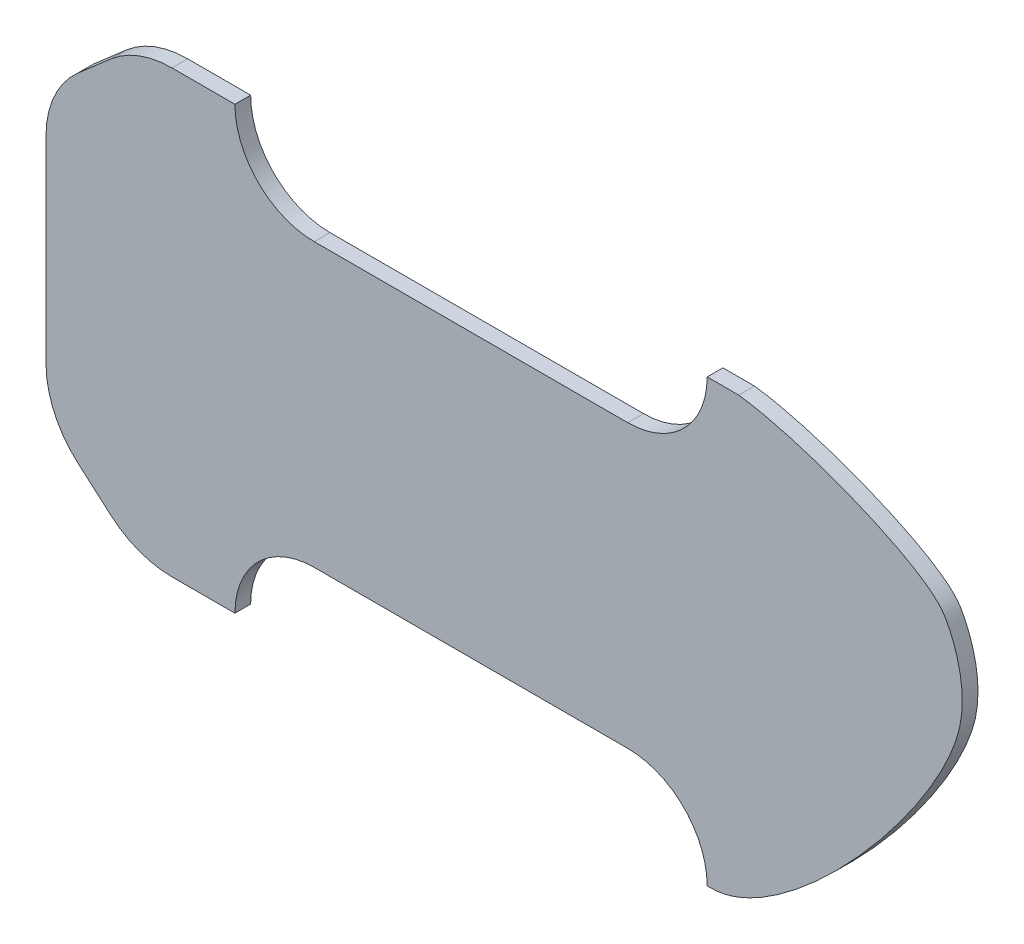
ISO-10303-21;
HEADER;
FILE_DESCRIPTION(('STEP AP214'),'2;1');
FILE_NAME('part.step','',(''),(''),'','','');
FILE_SCHEMA(('AUTOMOTIVE_DESIGN { 1 0 10303 214 1 1 1 1 }'));
ENDSEC;
DATA;
#1=APPLICATION_CONTEXT('core data for automotive mechanical design processes');
#2=APPLICATION_PROTOCOL_DEFINITION('international standard','automotive_design',2000,#1);
#3=PRODUCT_CONTEXT('',#1,'mechanical');
#4=PRODUCT('Part','Part','',(#3));
#5=PRODUCT_RELATED_PRODUCT_CATEGORY('part','',(#4));
#6=PRODUCT_DEFINITION_FORMATION('','',#4);
#7=PRODUCT_DEFINITION_CONTEXT('part definition',#1,'design');
#8=PRODUCT_DEFINITION('design','',#6,#7);
#9=PRODUCT_DEFINITION_SHAPE('','',#8);
#10=(LENGTH_UNIT() NAMED_UNIT(*) SI_UNIT(.MILLI.,.METRE.));
#11=(NAMED_UNIT(*) PLANE_ANGLE_UNIT() SI_UNIT($,.RADIAN.));
#12=(NAMED_UNIT(*) SI_UNIT($,.STERADIAN.) SOLID_ANGLE_UNIT());
#13=UNCERTAINTY_MEASURE_WITH_UNIT(LENGTH_MEASURE(1.E-05),#10,'distance_accuracy_value','');
#14=(GEOMETRIC_REPRESENTATION_CONTEXT(3) GLOBAL_UNCERTAINTY_ASSIGNED_CONTEXT((#13)) GLOBAL_UNIT_ASSIGNED_CONTEXT((#10,
#11,#12)) REPRESENTATION_CONTEXT('',''));
#15=CARTESIAN_POINT('',(0.,0.,0.));
#16=DIRECTION('',(0.,0.,1.));
#17=DIRECTION('',(1.,0.,0.));
#18=AXIS2_PLACEMENT_3D('',#15,#16,#17);
#19=CARTESIAN_POINT('',(-97.4720081677922,29.9649376847253,5.));
#20=DIRECTION('',(0.,0.,-1.));
#21=DIRECTION('',(-1.,0.,0.));
#22=AXIS2_PLACEMENT_3D('',#19,#20,#21);
#23=CYLINDRICAL_SURFACE('',#22,29.6194004211379);
#24=CARTESIAN_POINT('',(-97.4720081677922,29.9649376847253,0.));
#25=DIRECTION('',(0.,0.,1.));
#26=DIRECTION('',(-1.,0.,0.));
#27=AXIS2_PLACEMENT_3D('',#24,#25,#26);
#28=CIRCLE('',#27,29.6194004211379);
#29=CARTESIAN_POINT('',(-97.4720081677922,59.5843381058632,0.));
#30=VERTEX_POINT('',#29);
#31=CARTESIAN_POINT('',(-116.938550580624,52.2889742327407,0.));
#32=VERTEX_POINT('',#31);
#33=EDGE_CURVE('E186',#30,#32,#28,.T.);
#34=ORIENTED_EDGE('',*,*,#33,.T.);
#35=DIRECTION('',(0.,0.,-1.));
#36=VECTOR('',#35,1.);
#37=CARTESIAN_POINT('',(-116.938550580624,52.2889742327407,5.));
#38=LINE('',#37,#36);
#39=CARTESIAN_POINT('',(-116.938550580624,52.2889742327407,5.));
#40=VERTEX_POINT('',#39);
#41=EDGE_CURVE('E11',#40,#32,#38,.T.);
#42=ORIENTED_EDGE('',*,*,#41,.F.);
#43=CARTESIAN_POINT('',(-97.4720081677922,29.9649376847253,5.));
#44=DIRECTION('',(0.,0.,1.));
#45=DIRECTION('',(-1.,0.,0.));
#46=AXIS2_PLACEMENT_3D('',#43,#44,#45);
#47=CIRCLE('',#46,29.6194004211379);
#48=CARTESIAN_POINT('',(-97.4720081677922,59.5843381058632,5.));
#49=VERTEX_POINT('',#48);
#50=EDGE_CURVE('E225',#49,#40,#47,.T.);
#51=ORIENTED_EDGE('',*,*,#50,.F.);
#52=DIRECTION('',(0.,0.,-1.));
#53=VECTOR('',#52,1.);
#54=CARTESIAN_POINT('',(-97.4720081677922,59.5843381058632,5.));
#55=LINE('',#54,#53);
#56=EDGE_CURVE('E182',#49,#30,#55,.T.);
#57=ORIENTED_EDGE('',*,*,#56,.T.);
#58=EDGE_LOOP('',(#34,#42,#51,#57));
#59=FACE_BOUND('',#58,.T.);
#60=ADVANCED_FACE('F30',(#59),#23,.T.);
#61=CARTESIAN_POINT('',(-116.938550580624,52.2889742327407,5.));
#62=DIRECTION('',(0.657222703229989,-0.753696436477622,0.));
#63=DIRECTION('',(0.753696436477622,0.657222703229989,0.));
#64=AXIS2_PLACEMENT_3D('',#61,#62,#63);
#65=PLANE('',#64);
#66=DIRECTION('',(-0.753696436477622,-0.657222703229989,0.));
#67=VECTOR('',#66,1.);
#68=CARTESIAN_POINT('',(-116.938550580624,52.2889742327407,0.));
#69=LINE('',#68,#67);
#70=CARTESIAN_POINT('',(-127.318550580623,43.2376223497344,0.));
#71=VERTEX_POINT('',#70);
#72=EDGE_CURVE('E189',#32,#71,#69,.T.);
#73=ORIENTED_EDGE('',*,*,#72,.T.);
#74=DIRECTION('',(0.,0.,-1.));
#75=VECTOR('',#74,1.);
#76=CARTESIAN_POINT('',(-127.318550580623,43.2376223497344,5.));
#77=LINE('',#76,#75);
#78=CARTESIAN_POINT('',(-127.318550580623,43.2376223497344,5.));
#79=VERTEX_POINT('',#78);
#80=EDGE_CURVE('E38',#79,#71,#77,.T.);
#81=ORIENTED_EDGE('',*,*,#80,.F.);
#82=DIRECTION('',(-0.753696436477622,-0.657222703229989,0.));
#83=VECTOR('',#82,1.);
#84=CARTESIAN_POINT('',(-116.938550580624,52.2889742327407,5.));
#85=LINE('',#84,#83);
#86=EDGE_CURVE('E119',#40,#79,#85,.T.);
#87=ORIENTED_EDGE('',*,*,#86,.F.);
#88=ORIENTED_EDGE('',*,*,#41,.T.);
#89=EDGE_LOOP('',(#73,#81,#87,#88));
#90=FACE_BOUND('',#89,.T.);
#91=ADVANCED_FACE('F356',(#90),#65,.F.);
#92=CARTESIAN_POINT('',(-107.852008167791,20.913585801719,5.));
#93=DIRECTION('',(0.,0.,-1.));
#94=DIRECTION('',(-1.,0.,0.));
#95=AXIS2_PLACEMENT_3D('',#92,#93,#94);
#96=CYLINDRICAL_SURFACE('',#95,29.6194004211379);
#97=CARTESIAN_POINT('',(-107.852008167791,20.913585801719,0.));
#98=DIRECTION('',(0.,0.,1.));
#99=DIRECTION('',(-1.,0.,0.));
#100=AXIS2_PLACEMENT_3D('',#97,#98,#99);
#101=CIRCLE('',#100,29.6194004211379);
#102=CARTESIAN_POINT('',(-137.471408588929,20.913585801719,0.));
#103=VERTEX_POINT('',#102);
#104=EDGE_CURVE('E191',#71,#103,#101,.T.);
#105=ORIENTED_EDGE('',*,*,#104,.T.);
#106=DIRECTION('',(0.,0.,-1.));
#107=VECTOR('',#106,1.);
#108=CARTESIAN_POINT('',(-137.471408588929,20.913585801719,5.));
#109=LINE('',#108,#107);
#110=CARTESIAN_POINT('',(-137.471408588929,20.913585801719,5.));
#111=VERTEX_POINT('',#110);
#112=EDGE_CURVE('E262',#111,#103,#109,.T.);
#113=ORIENTED_EDGE('',*,*,#112,.F.);
#114=CARTESIAN_POINT('',(-107.852008167791,20.913585801719,5.));
#115=DIRECTION('',(0.,0.,1.));
#116=DIRECTION('',(-1.,0.,0.));
#117=AXIS2_PLACEMENT_3D('',#114,#115,#116);
#118=CIRCLE('',#117,29.6194004211379);
#119=EDGE_CURVE('E270',#79,#111,#118,.T.);
#120=ORIENTED_EDGE('',*,*,#119,.F.);
#121=ORIENTED_EDGE('',*,*,#80,.T.);
#122=EDGE_LOOP('',(#105,#113,#120,#121));
#123=FACE_BOUND('',#122,.T.);
#124=ADVANCED_FACE('F268',(#123),#96,.T.);
#125=CARTESIAN_POINT('',(-137.471408588929,-41.7462614729989,5.));
#126=DIRECTION('',(1.,0.,0.));
#127=DIRECTION('',(0.,1.,0.));
#128=AXIS2_PLACEMENT_3D('',#125,#126,#127);
#129=PLANE('',#128);
#130=DIRECTION('',(0.,-1.,0.));
#131=VECTOR('',#130,1.);
#132=CARTESIAN_POINT('',(-137.471408588929,-41.7462614729989,0.));
#133=LINE('',#132,#131);
#134=CARTESIAN_POINT('',(-137.471408588929,-41.7462614729989,0.));
#135=VERTEX_POINT('',#134);
#136=EDGE_CURVE('E193',#103,#135,#133,.T.);
#137=ORIENTED_EDGE('',*,*,#136,.T.);
#138=DIRECTION('',(0.,0.,-1.));
#139=VECTOR('',#138,1.);
#140=CARTESIAN_POINT('',(-137.471408588929,-41.7462614729989,5.));
#141=LINE('',#140,#139);
#142=CARTESIAN_POINT('',(-137.471408588929,-41.7462614729989,5.));
#143=VERTEX_POINT('',#142);
#144=EDGE_CURVE('E259',#143,#135,#141,.T.);
#145=ORIENTED_EDGE('',*,*,#144,.F.);
#146=DIRECTION('',(0.,-1.,0.));
#147=VECTOR('',#146,1.);
#148=CARTESIAN_POINT('',(-137.471408588929,-41.7462614729989,5.));
#149=LINE('',#148,#147);
#150=EDGE_CURVE('E288',#111,#143,#149,.T.);
#151=ORIENTED_EDGE('',*,*,#150,.F.);
#152=ORIENTED_EDGE('',*,*,#112,.T.);
#153=EDGE_LOOP('',(#137,#145,#151,#152));
#154=FACE_BOUND('',#153,.T.);
#155=ADVANCED_FACE('F279',(#154),#129,.F.);
#156=CARTESIAN_POINT('',(-107.852008167791,-41.7462614729989,5.));
#157=DIRECTION('',(0.,0.,-1.));
#158=DIRECTION('',(-1.,0.,0.));
#159=AXIS2_PLACEMENT_3D('',#156,#157,#158);
#160=CYLINDRICAL_SURFACE('',#159,29.6194004211379);
#161=CARTESIAN_POINT('',(-107.852008167791,-41.7462614729989,0.));
#162=DIRECTION('',(0.,0.,1.));
#163=DIRECTION('',(-1.,0.,0.));
#164=AXIS2_PLACEMENT_3D('',#161,#162,#163);
#165=CIRCLE('',#164,29.6194004211379);
#166=CARTESIAN_POINT('',(-127.316898811166,-64.0717382551234,0.));
#167=VERTEX_POINT('',#166);
#168=EDGE_CURVE('E195',#135,#167,#165,.T.);
#169=ORIENTED_EDGE('',*,*,#168,.T.);
#170=DIRECTION('',(0.,0.,-1.));
#171=VECTOR('',#170,1.);
#172=CARTESIAN_POINT('',(-127.316898811166,-64.0717382551234,5.));
#173=LINE('',#172,#171);
#174=CARTESIAN_POINT('',(-127.316898811166,-64.0717382551234,5.));
#175=VERTEX_POINT('',#174);
#176=EDGE_CURVE('E256',#175,#167,#173,.T.);
#177=ORIENTED_EDGE('',*,*,#176,.F.);
#178=CARTESIAN_POINT('',(-107.852008167791,-41.7462614729989,5.));
#179=DIRECTION('',(0.,0.,1.));
#180=DIRECTION('',(-1.,0.,0.));
#181=AXIS2_PLACEMENT_3D('',#178,#179,#180);
#182=CIRCLE('',#181,29.6194004211379);
#183=EDGE_CURVE('E285',#143,#175,#182,.T.);
#184=ORIENTED_EDGE('',*,*,#183,.F.);
#185=ORIENTED_EDGE('',*,*,#144,.T.);
#186=EDGE_LOOP('',(#169,#177,#184,#185));
#187=FACE_BOUND('',#186,.T.);
#188=ADVANCED_FACE('F283',(#187),#160,.T.);
#189=CARTESIAN_POINT('',(-116.936898811166,-73.1217382551234,5.));
#190=DIRECTION('',(0.657166936758224,0.753745061165785,0.));
#191=DIRECTION('',(-0.753745061165785,0.657166936758224,0.));
#192=AXIS2_PLACEMENT_3D('',#189,#190,#191);
#193=PLANE('',#192);
#194=DIRECTION('',(0.753745061165785,-0.657166936758224,0.));
#195=VECTOR('',#194,1.);
#196=CARTESIAN_POINT('',(-116.936898811166,-73.1217382551234,0.));
#197=LINE('',#196,#195);
#198=CARTESIAN_POINT('',(-116.936898811166,-73.1217382551234,0.));
#199=VERTEX_POINT('',#198);
#200=EDGE_CURVE('E197',#167,#199,#197,.T.);
#201=ORIENTED_EDGE('',*,*,#200,.T.);
#202=DIRECTION('',(0.,0.,-1.));
#203=VECTOR('',#202,1.);
#204=CARTESIAN_POINT('',(-116.936898811166,-73.1217382551234,5.));
#205=LINE('',#204,#203);
#206=CARTESIAN_POINT('',(-116.936898811166,-73.1217382551234,5.));
#207=VERTEX_POINT('',#206);
#208=EDGE_CURVE('E253',#207,#199,#205,.T.);
#209=ORIENTED_EDGE('',*,*,#208,.F.);
#210=DIRECTION('',(0.753745061165785,-0.657166936758224,0.));
#211=VECTOR('',#210,1.);
#212=CARTESIAN_POINT('',(-116.936898811166,-73.1217382551234,5.));
#213=LINE('',#212,#211);
#214=EDGE_CURVE('E287',#175,#207,#213,.T.);
#215=ORIENTED_EDGE('',*,*,#214,.F.);
#216=ORIENTED_EDGE('',*,*,#176,.T.);
#217=EDGE_LOOP('',(#201,#209,#215,#216));
#218=FACE_BOUND('',#217,.T.);
#219=ADVANCED_FACE('F346',(#218),#193,.F.);
#220=CARTESIAN_POINT('',(-97.4720081677914,-50.7962614729989,5.));
#221=DIRECTION('',(0.,0.,-1.));
#222=DIRECTION('',(-1.,0.,0.));
#223=AXIS2_PLACEMENT_3D('',#220,#221,#222);
#224=CYLINDRICAL_SURFACE('',#223,29.6194004211379);
#225=CARTESIAN_POINT('',(-97.4720081677914,-50.7962614729989,0.));
#226=DIRECTION('',(0.,0.,1.));
#227=DIRECTION('',(-1.,0.,0.));
#228=AXIS2_PLACEMENT_3D('',#225,#226,#227);
#229=CIRCLE('',#228,29.6194004211379);
#230=CARTESIAN_POINT('',(-97.4720081677914,-80.4156618941369,0.));
#231=VERTEX_POINT('',#230);
#232=EDGE_CURVE('E199',#199,#231,#229,.T.);
#233=ORIENTED_EDGE('',*,*,#232,.T.);
#234=DIRECTION('',(0.,0.,-1.));
#235=VECTOR('',#234,1.);
#236=CARTESIAN_POINT('',(-97.4720081677914,-80.4156618941369,5.));
#237=LINE('',#236,#235);
#238=CARTESIAN_POINT('',(-97.4720081677914,-80.4156618941369,5.));
#239=VERTEX_POINT('',#238);
#240=EDGE_CURVE('E250',#239,#231,#237,.T.);
#241=ORIENTED_EDGE('',*,*,#240,.F.);
#242=CARTESIAN_POINT('',(-97.4720081677914,-50.7962614729989,5.));
#243=DIRECTION('',(0.,0.,1.));
#244=DIRECTION('',(-1.,0.,0.));
#245=AXIS2_PLACEMENT_3D('',#242,#243,#244);
#246=CIRCLE('',#245,29.6194004211379);
#247=EDGE_CURVE('E290',#207,#239,#246,.T.);
#248=ORIENTED_EDGE('',*,*,#247,.F.);
#249=ORIENTED_EDGE('',*,*,#208,.T.);
#250=EDGE_LOOP('',(#233,#241,#248,#249));
#251=FACE_BOUND('',#250,.T.);
#252=ADVANCED_FACE('F342',(#251),#224,.T.);
#253=CARTESIAN_POINT('',(-77.4720081677914,-80.4156618941368,5.));
#254=DIRECTION('',(0.,1.,0.));
#255=DIRECTION('',(-1.,0.,0.));
#256=AXIS2_PLACEMENT_3D('',#253,#254,#255);
#257=PLANE('',#256);
#258=DIRECTION('',(1.,0.,0.));
#259=VECTOR('',#258,1.);
#260=CARTESIAN_POINT('',(-77.4720081677914,-80.4156618941368,0.));
#261=LINE('',#260,#259);
#262=CARTESIAN_POINT('',(-77.4720081677914,-80.4156618941368,0.));
#263=VERTEX_POINT('',#262);
#264=EDGE_CURVE('E201',#231,#263,#261,.T.);
#265=ORIENTED_EDGE('',*,*,#264,.T.);
#266=DIRECTION('',(0.,0.,-1.));
#267=VECTOR('',#266,1.);
#268=CARTESIAN_POINT('',(-77.4720081677914,-80.4156618941368,5.));
#269=LINE('',#268,#267);
#270=CARTESIAN_POINT('',(-77.4720081677914,-80.4156618941368,5.));
#271=VERTEX_POINT('',#270);
#272=EDGE_CURVE('E247',#271,#263,#269,.T.);
#273=ORIENTED_EDGE('',*,*,#272,.F.);
#274=DIRECTION('',(1.,0.,0.));
#275=VECTOR('',#274,1.);
#276=CARTESIAN_POINT('',(-77.4720081677914,-80.4156618941368,5.));
#277=LINE('',#276,#275);
#278=EDGE_CURVE('E296',#239,#271,#277,.T.);
#279=ORIENTED_EDGE('',*,*,#278,.F.);
#280=ORIENTED_EDGE('',*,*,#240,.T.);
#281=EDGE_LOOP('',(#265,#273,#279,#280));
#282=FACE_BOUND('',#281,.T.);
#283=ADVANCED_FACE('F338',(#282),#257,.F.);
#284=CARTESIAN_POINT('',(-52.2720081677923,-80.4156618941359,5.));
#285=DIRECTION('',(0.,0.,-1.));
#286=DIRECTION('',(-1.,0.,0.));
#287=AXIS2_PLACEMENT_3D('',#284,#285,#286);
#288=CYLINDRICAL_SURFACE('',#287,25.1999999999991);
#289=CARTESIAN_POINT('',(-52.2720081677923,-80.4156618941359,0.));
#290=DIRECTION('',(0.,0.,-1.));
#291=DIRECTION('',(-1.,0.,0.));
#292=AXIS2_PLACEMENT_3D('',#289,#290,#291);
#293=CIRCLE('',#292,25.1999999999991);
#294=CARTESIAN_POINT('',(-52.2720081677917,-55.2156618941368,0.));
#295=VERTEX_POINT('',#294);
#296=EDGE_CURVE('E203',#263,#295,#293,.T.);
#297=ORIENTED_EDGE('',*,*,#296,.T.);
#298=DIRECTION('',(0.,0.,-1.));
#299=VECTOR('',#298,1.);
#300=CARTESIAN_POINT('',(-52.2720081677917,-55.2156618941368,5.));
#301=LINE('',#300,#299);
#302=CARTESIAN_POINT('',(-52.2720081677917,-55.2156618941368,5.));
#303=VERTEX_POINT('',#302);
#304=EDGE_CURVE('E244',#303,#295,#301,.T.);
#305=ORIENTED_EDGE('',*,*,#304,.F.);
#306=CARTESIAN_POINT('',(-52.2720081677923,-80.4156618941359,5.));
#307=DIRECTION('',(0.,0.,-1.));
#308=DIRECTION('',(-1.,0.,0.));
#309=AXIS2_PLACEMENT_3D('',#306,#307,#308);
#310=CIRCLE('',#309,25.1999999999991);
#311=EDGE_CURVE('E298',#271,#303,#310,.T.);
#312=ORIENTED_EDGE('',*,*,#311,.F.);
#313=ORIENTED_EDGE('',*,*,#272,.T.);
#314=EDGE_LOOP('',(#297,#305,#312,#313));
#315=FACE_BOUND('',#314,.T.);
#316=ADVANCED_FACE('F334',(#315),#288,.F.);
#317=CARTESIAN_POINT('',(-52.2720081677917,-55.2156618941368,5.));
#318=DIRECTION('',(0.,1.,0.));
#319=DIRECTION('',(-1.,0.,0.));
#320=AXIS2_PLACEMENT_3D('',#317,#318,#319);
#321=PLANE('',#320);
#322=DIRECTION('',(1.,0.,0.));
#323=VECTOR('',#322,1.);
#324=CARTESIAN_POINT('',(-52.2720081677917,-55.2156618941368,0.));
#325=LINE('',#324,#323);
#326=CARTESIAN_POINT('',(47.3279918322083,-55.2156618941368,0.));
#327=VERTEX_POINT('',#326);
#328=EDGE_CURVE('E205',#295,#327,#325,.T.);
#329=ORIENTED_EDGE('',*,*,#328,.T.);
#330=DIRECTION('',(0.,0.,-1.));
#331=VECTOR('',#330,1.);
#332=CARTESIAN_POINT('',(47.3279918322083,-55.2156618941368,5.));
#333=LINE('',#332,#331);
#334=CARTESIAN_POINT('',(47.3279918322083,-55.2156618941368,5.));
#335=VERTEX_POINT('',#334);
#336=EDGE_CURVE('E241',#335,#327,#333,.T.);
#337=ORIENTED_EDGE('',*,*,#336,.F.);
#338=DIRECTION('',(1.,0.,0.));
#339=VECTOR('',#338,1.);
#340=CARTESIAN_POINT('',(-52.2720081677917,-55.2156618941368,5.));
#341=LINE('',#340,#339);
#342=EDGE_CURVE('E300',#303,#335,#341,.T.);
#343=ORIENTED_EDGE('',*,*,#342,.F.);
#344=ORIENTED_EDGE('',*,*,#304,.T.);
#345=EDGE_LOOP('',(#329,#337,#343,#344));
#346=FACE_BOUND('',#345,.T.);
#347=ADVANCED_FACE('F330',(#346),#321,.F.);
#348=CARTESIAN_POINT('',(47.327991832209,-80.4156618941363,5.));
#349=DIRECTION('',(0.,0.,-1.));
#350=DIRECTION('',(-1.,0.,0.));
#351=AXIS2_PLACEMENT_3D('',#348,#349,#350);
#352=CYLINDRICAL_SURFACE('',#351,25.1999999999996);
#353=CARTESIAN_POINT('',(47.327991832209,-80.4156618941363,0.));
#354=DIRECTION('',(0.,0.,-1.));
#355=DIRECTION('',(1.,0.,0.));
#356=AXIS2_PLACEMENT_3D('',#353,#354,#355);
#357=CIRCLE('',#356,25.1999999999996);
#358=CARTESIAN_POINT('',(72.5279918322085,-80.4156618941368,0.));
#359=VERTEX_POINT('',#358);
#360=EDGE_CURVE('E207',#327,#359,#357,.T.);
#361=ORIENTED_EDGE('',*,*,#360,.T.);
#362=DIRECTION('',(0.,0.,-1.));
#363=VECTOR('',#362,1.);
#364=CARTESIAN_POINT('',(72.5279918322085,-80.4156618941368,5.));
#365=LINE('',#364,#363);
#366=CARTESIAN_POINT('',(72.5279918322085,-80.4156618941368,5.));
#367=VERTEX_POINT('',#366);
#368=EDGE_CURVE('E238',#367,#359,#365,.T.);
#369=ORIENTED_EDGE('',*,*,#368,.F.);
#370=CARTESIAN_POINT('',(47.327991832209,-80.4156618941363,5.));
#371=DIRECTION('',(0.,0.,-1.));
#372=DIRECTION('',(1.,0.,0.));
#373=AXIS2_PLACEMENT_3D('',#370,#371,#372);
#374=CIRCLE('',#373,25.1999999999996);
#375=EDGE_CURVE('E302',#335,#367,#374,.T.);
#376=ORIENTED_EDGE('',*,*,#375,.F.);
#377=ORIENTED_EDGE('',*,*,#336,.T.);
#378=EDGE_LOOP('',(#361,#369,#376,#377));
#379=FACE_BOUND('',#378,.T.);
#380=ADVANCED_FACE('F326',(#379),#352,.F.);
#381=CARTESIAN_POINT('',(72.5279918322085,-80.4156618941368,5.));
#382=DIRECTION('',(0.,1.,0.));
#383=DIRECTION('',(-1.,0.,0.));
#384=AXIS2_PLACEMENT_3D('',#381,#382,#383);
#385=PLANE('',#384);
#386=DIRECTION('',(1.,0.,0.));
#387=VECTOR('',#386,1.);
#388=CARTESIAN_POINT('',(72.5279918322085,-80.4156618941368,0.));
#389=LINE('',#388,#387);
#390=CARTESIAN_POINT('',(73.5279918322085,-80.4156618941368,0.));
#391=VERTEX_POINT('',#390);
#392=EDGE_CURVE('E209',#359,#391,#389,.T.);
#393=ORIENTED_EDGE('',*,*,#392,.T.);
#394=DIRECTION('',(0.,0.,-1.));
#395=VECTOR('',#394,1.);
#396=CARTESIAN_POINT('',(73.5279918322085,-80.4156618941368,5.));
#397=LINE('',#396,#395);
#398=CARTESIAN_POINT('',(73.5279918322085,-80.4156618941368,5.));
#399=VERTEX_POINT('',#398);
#400=EDGE_CURVE('E235',#399,#391,#397,.T.);
#401=ORIENTED_EDGE('',*,*,#400,.F.);
#402=DIRECTION('',(1.,0.,0.));
#403=VECTOR('',#402,1.);
#404=CARTESIAN_POINT('',(72.5279918322085,-80.4156618941368,5.));
#405=LINE('',#404,#403);
#406=EDGE_CURVE('E304',#367,#399,#405,.T.);
#407=ORIENTED_EDGE('',*,*,#406,.F.);
#408=ORIENTED_EDGE('',*,*,#368,.T.);
#409=EDGE_LOOP('',(#393,#401,#407,#408));
#410=FACE_BOUND('',#409,.T.);
#411=ADVANCED_FACE('F321',(#410),#385,.F.);
#412=CARTESIAN_POINT('',(73.5279918322082,-80.4156618941368,5.));
#413=CARTESIAN_POINT('',(97.2752087293803,-80.8319642514989,5.));
#414=CARTESIAN_POINT('',(151.364335726008,-18.596789103441,5.));
#415=CARTESIAN_POINT('',(154.234118929359,16.0171985525357,5.));
#416=CARTESIAN_POINT('',(150.722775832446,26.7588907180184,5.));
#417=CARTESIAN_POINT('',(142.468880392094,41.5904713392385,5.));
#418=CARTESIAN_POINT('',(101.294887559195,57.3452256092724,5.));
#419=CARTESIAN_POINT('',(82.5279918322078,59.5843381058632,5.));
#420=B_SPLINE_CURVE_WITH_KNOTS('',3,(#412,#413,#414,#415,#416,#417,#418,#419),.UNSPECIFIED.,.F.,
.F.,(4,1,1,1,1,4),(0.,0.438378485880688,0.503563712379199,0.635375759140011,0.686667038486601,
1.),.UNSPECIFIED.);
#421=DIRECTION('',(0.,0.,-1.));
#422=VECTOR('',#421,1.);
#423=SURFACE_OF_LINEAR_EXTRUSION('',#420,#422);
#424=CARTESIAN_POINT('',(73.5279918322082,-80.4156618941368,0.));
#425=CARTESIAN_POINT('',(97.2752087293803,-80.8319642514989,0.));
#426=CARTESIAN_POINT('',(151.364335726008,-18.596789103441,0.));
#427=CARTESIAN_POINT('',(154.234118929359,16.0171985525357,0.));
#428=CARTESIAN_POINT('',(150.722775832446,26.7588907180184,0.));
#429=CARTESIAN_POINT('',(142.468880392094,41.5904713392385,0.));
#430=CARTESIAN_POINT('',(101.294887559195,57.3452256092724,0.));
#431=CARTESIAN_POINT('',(82.5279918322078,59.5843381058632,0.));
#432=B_SPLINE_CURVE_WITH_KNOTS('',3,(#424,#425,#426,#427,#428,#429,#430,#431),.UNSPECIFIED.,.F.,
.F.,(4,1,1,1,1,4),(0.,0.438378485880688,0.503563712379199,0.635375759140011,0.686667038486601,
1.),.UNSPECIFIED.);
#433=CARTESIAN_POINT('',(82.5279918322078,59.5843381058632,0.));
#434=VERTEX_POINT('',#433);
#435=EDGE_CURVE('E211',#391,#434,#432,.T.);
#436=ORIENTED_EDGE('',*,*,#435,.T.);
#437=DIRECTION('',(0.,0.,-1.));
#438=VECTOR('',#437,1.);
#439=CARTESIAN_POINT('',(82.5279918322078,59.5843381058632,5.));
#440=LINE('',#439,#438);
#441=CARTESIAN_POINT('',(82.5279918322078,59.5843381058632,5.));
#442=VERTEX_POINT('',#441);
#443=EDGE_CURVE('E232',#442,#434,#440,.T.);
#444=ORIENTED_EDGE('',*,*,#443,.F.);
#445=EDGE_CURVE('E306',#399,#442,#420,.T.);
#446=ORIENTED_EDGE('',*,*,#445,.F.);
#447=ORIENTED_EDGE('',*,*,#400,.T.);
#448=EDGE_LOOP('',(#436,#444,#446,#447));
#449=FACE_BOUND('',#448,.T.);
#450=ADVANCED_FACE('F316',(#449),#423,.F.);
#451=CARTESIAN_POINT('',(72.5279918322078,59.5843381058647,5.));
#452=DIRECTION('',(0.,-1.,0.));
#453=DIRECTION('',(0.,0.,-1.));
#454=AXIS2_PLACEMENT_3D('',#451,#452,#453);
#455=PLANE('',#454);
#456=DIRECTION('',(-1.,0.,0.));
#457=VECTOR('',#456,1.);
#458=CARTESIAN_POINT('',(72.5279918322078,59.5843381058647,0.));
#459=LINE('',#458,#457);
#460=CARTESIAN_POINT('',(72.5279918322078,59.5843381058647,0.));
#461=VERTEX_POINT('',#460);
#462=EDGE_CURVE('E215',#434,#461,#459,.T.);
#463=ORIENTED_EDGE('',*,*,#462,.T.);
#464=DIRECTION('',(0.,0.,-1.));
#465=VECTOR('',#464,1.);
#466=CARTESIAN_POINT('',(72.5279918322078,59.5843381058647,5.));
#467=LINE('',#466,#465);
#468=CARTESIAN_POINT('',(72.5279918322078,59.5843381058647,5.));
#469=VERTEX_POINT('',#468);
#470=EDGE_CURVE('E229',#469,#461,#467,.T.);
#471=ORIENTED_EDGE('',*,*,#470,.F.);
#472=DIRECTION('',(-1.,0.,0.));
#473=VECTOR('',#472,1.);
#474=CARTESIAN_POINT('',(72.5279918322078,59.5843381058647,5.));
#475=LINE('',#474,#473);
#476=EDGE_CURVE('E311',#442,#469,#475,.T.);
#477=ORIENTED_EDGE('',*,*,#476,.F.);
#478=ORIENTED_EDGE('',*,*,#443,.T.);
#479=EDGE_LOOP('',(#463,#471,#477,#478));
#480=FACE_BOUND('',#479,.T.);
#481=ADVANCED_FACE('F320',(#480),#455,.F.);
#482=CARTESIAN_POINT('',(47.3279918322085,59.5843381058625,5.));
#483=DIRECTION('',(0.,0.,-1.));
#484=DIRECTION('',(-1.,0.,0.));
#485=AXIS2_PLACEMENT_3D('',#482,#483,#484);
#486=CYLINDRICAL_SURFACE('',#485,25.1999999999993);
#487=CARTESIAN_POINT('',(47.3279918322085,59.5843381058625,0.));
#488=DIRECTION('',(0.,0.,-1.));
#489=DIRECTION('',(-1.,0.,0.));
#490=AXIS2_PLACEMENT_3D('',#487,#488,#489);
#491=CIRCLE('',#490,25.1999999999993);
#492=CARTESIAN_POINT('',(47.3279918322083,34.3843381058632,0.));
#493=VERTEX_POINT('',#492);
#494=EDGE_CURVE('E220',#461,#493,#491,.T.);
#495=ORIENTED_EDGE('',*,*,#494,.T.);
#496=DIRECTION('',(0.,0.,-1.));
#497=VECTOR('',#496,1.);
#498=CARTESIAN_POINT('',(47.3279918322083,34.3843381058632,5.));
#499=LINE('',#498,#497);
#500=CARTESIAN_POINT('',(47.3279918322083,34.3843381058632,5.));
#501=VERTEX_POINT('',#500);
#502=EDGE_CURVE('E177',#501,#493,#499,.T.);
#503=ORIENTED_EDGE('',*,*,#502,.F.);
#504=CARTESIAN_POINT('',(47.3279918322085,59.5843381058625,5.));
#505=DIRECTION('',(0.,0.,-1.));
#506=DIRECTION('',(-1.,0.,0.));
#507=AXIS2_PLACEMENT_3D('',#504,#505,#506);
#508=CIRCLE('',#507,25.1999999999993);
#509=EDGE_CURVE('E168',#469,#501,#508,.T.);
#510=ORIENTED_EDGE('',*,*,#509,.F.);
#511=ORIENTED_EDGE('',*,*,#470,.T.);
#512=EDGE_LOOP('',(#495,#503,#510,#511));
#513=FACE_BOUND('',#512,.T.);
#514=ADVANCED_FACE('F368',(#513),#486,.F.);
#515=CARTESIAN_POINT('',(-52.2720081677917,34.3843381058632,5.));
#516=DIRECTION('',(0.,-1.,0.));
#517=DIRECTION('',(0.,0.,-1.));
#518=AXIS2_PLACEMENT_3D('',#515,#516,#517);
#519=PLANE('',#518);
#520=DIRECTION('',(-1.,0.,0.));
#521=VECTOR('',#520,1.);
#522=CARTESIAN_POINT('',(-52.2720081677917,34.3843381058632,0.));
#523=LINE('',#522,#521);
#524=CARTESIAN_POINT('',(-52.2720081677917,34.3843381058632,0.));
#525=VERTEX_POINT('',#524);
#526=EDGE_CURVE('E176',#493,#525,#523,.T.);
#527=ORIENTED_EDGE('',*,*,#526,.T.);
#528=DIRECTION('',(0.,0.,-1.));
#529=VECTOR('',#528,1.);
#530=CARTESIAN_POINT('',(-52.2720081677917,34.3843381058632,5.));
#531=LINE('',#530,#529);
#532=CARTESIAN_POINT('',(-52.2720081677917,34.3843381058632,5.));
#533=VERTEX_POINT('',#532);
#534=EDGE_CURVE('E173',#533,#525,#531,.T.);
#535=ORIENTED_EDGE('',*,*,#534,.F.);
#536=DIRECTION('',(-1.,0.,0.));
#537=VECTOR('',#536,1.);
#538=CARTESIAN_POINT('',(-52.2720081677917,34.3843381058632,5.));
#539=LINE('',#538,#537);
#540=EDGE_CURVE('E162',#501,#533,#539,.T.);
#541=ORIENTED_EDGE('',*,*,#540,.F.);
#542=ORIENTED_EDGE('',*,*,#502,.T.);
#543=EDGE_LOOP('',(#527,#535,#541,#542));
#544=FACE_BOUND('',#543,.T.);
#545=ADVANCED_FACE('F174',(#544),#519,.F.);
#546=CARTESIAN_POINT('',(-52.2720081677922,59.5843381058632,5.));
#547=DIRECTION('',(0.,0.,-1.));
#548=DIRECTION('',(-1.,0.,0.));
#549=AXIS2_PLACEMENT_3D('',#546,#547,#548);
#550=CYLINDRICAL_SURFACE('',#549,25.2);
#551=CARTESIAN_POINT('',(-52.2720081677922,59.5843381058632,0.));
#552=DIRECTION('',(0.,0.,-1.));
#553=DIRECTION('',(1.,0.,0.));
#554=AXIS2_PLACEMENT_3D('',#551,#552,#553);
#555=CIRCLE('',#554,25.2);
#556=CARTESIAN_POINT('',(-77.4720081677922,59.5843381058632,0.));
#557=VERTEX_POINT('',#556);
#558=EDGE_CURVE('E105',#525,#557,#555,.T.);
#559=ORIENTED_EDGE('',*,*,#558,.T.);
#560=DIRECTION('',(0.,0.,-1.));
#561=VECTOR('',#560,1.);
#562=CARTESIAN_POINT('',(-77.4720081677922,59.5843381058632,5.));
#563=LINE('',#562,#561);
#564=CARTESIAN_POINT('',(-77.4720081677922,59.5843381058632,5.));
#565=VERTEX_POINT('',#564);
#566=EDGE_CURVE('E178',#565,#557,#563,.T.);
#567=ORIENTED_EDGE('',*,*,#566,.F.);
#568=CARTESIAN_POINT('',(-52.2720081677922,59.5843381058632,5.));
#569=DIRECTION('',(0.,0.,-1.));
#570=DIRECTION('',(1.,0.,0.));
#571=AXIS2_PLACEMENT_3D('',#568,#569,#570);
#572=CIRCLE('',#571,25.2);
#573=EDGE_CURVE('E166',#533,#565,#572,.T.);
#574=ORIENTED_EDGE('',*,*,#573,.F.);
#575=ORIENTED_EDGE('',*,*,#534,.T.);
#576=EDGE_LOOP('',(#559,#567,#574,#575));
#577=FACE_BOUND('',#576,.T.);
#578=ADVANCED_FACE('F180',(#577),#550,.F.);
#579=CARTESIAN_POINT('',(-77.4720081677922,59.5843381058632,5.));
#580=DIRECTION('',(0.,-1.,0.));
#581=DIRECTION('',(0.,0.,-1.));
#582=AXIS2_PLACEMENT_3D('',#579,#580,#581);
#583=PLANE('',#582);
#584=DIRECTION('',(-1.,0.,0.));
#585=VECTOR('',#584,1.);
#586=CARTESIAN_POINT('',(-77.4720081677922,59.5843381058632,0.));
#587=LINE('',#586,#585);
#588=EDGE_CURVE('E111',#557,#30,#587,.T.);
#589=ORIENTED_EDGE('',*,*,#588,.T.);
#590=ORIENTED_EDGE('',*,*,#56,.F.);
#591=DIRECTION('',(-1.,0.,0.));
#592=VECTOR('',#591,1.);
#593=CARTESIAN_POINT('',(-77.4720081677922,59.5843381058632,5.));
#594=LINE('',#593,#592);
#595=EDGE_CURVE('E46',#565,#49,#594,.T.);
#596=ORIENTED_EDGE('',*,*,#595,.F.);
#597=ORIENTED_EDGE('',*,*,#566,.T.);
#598=EDGE_LOOP('',(#589,#590,#596,#597));
#599=FACE_BOUND('',#598,.T.);
#600=ADVANCED_FACE('F404',(#599),#583,.F.);
#601=CARTESIAN_POINT('',(-97.4720081677922,29.9649376847253,5.));
#602=DIRECTION('',(0.,0.,-1.));
#603=DIRECTION('',(-1.,0.,0.));
#604=AXIS2_PLACEMENT_3D('',#601,#602,#603);
#605=PLANE('',#604);
#606=ORIENTED_EDGE('',*,*,#50,.T.);
#607=ORIENTED_EDGE('',*,*,#86,.T.);
#608=ORIENTED_EDGE('',*,*,#119,.T.);
#609=ORIENTED_EDGE('',*,*,#150,.T.);
#610=ORIENTED_EDGE('',*,*,#183,.T.);
#611=ORIENTED_EDGE('',*,*,#214,.T.);
#612=ORIENTED_EDGE('',*,*,#247,.T.);
#613=ORIENTED_EDGE('',*,*,#278,.T.);
#614=ORIENTED_EDGE('',*,*,#311,.T.);
#615=ORIENTED_EDGE('',*,*,#342,.T.);
#616=ORIENTED_EDGE('',*,*,#375,.T.);
#617=ORIENTED_EDGE('',*,*,#406,.T.);
#618=ORIENTED_EDGE('',*,*,#445,.T.);
#619=ORIENTED_EDGE('',*,*,#476,.T.);
#620=ORIENTED_EDGE('',*,*,#509,.T.);
#621=ORIENTED_EDGE('',*,*,#540,.T.);
#622=ORIENTED_EDGE('',*,*,#573,.T.);
#623=ORIENTED_EDGE('',*,*,#595,.T.);
#624=EDGE_LOOP('',(#606,#607,#608,#609,#610,#611,#612,#613,#614,#615,#616,#617,#618,#619,#620,
#621,#622,#623));
#625=FACE_BOUND('',#624,.T.);
#626=ADVANCED_FACE('F164',(#625),#605,.F.);
#627=CARTESIAN_POINT('',(-97.4720081677922,29.9649376847253,0.));
#628=DIRECTION('',(0.,0.,-1.));
#629=DIRECTION('',(-1.,0.,0.));
#630=AXIS2_PLACEMENT_3D('',#627,#628,#629);
#631=PLANE('',#630);
#632=ORIENTED_EDGE('',*,*,#33,.F.);
#633=ORIENTED_EDGE('',*,*,#588,.F.);
#634=ORIENTED_EDGE('',*,*,#558,.F.);
#635=ORIENTED_EDGE('',*,*,#526,.F.);
#636=ORIENTED_EDGE('',*,*,#494,.F.);
#637=ORIENTED_EDGE('',*,*,#462,.F.);
#638=ORIENTED_EDGE('',*,*,#435,.F.);
#639=ORIENTED_EDGE('',*,*,#392,.F.);
#640=ORIENTED_EDGE('',*,*,#360,.F.);
#641=ORIENTED_EDGE('',*,*,#328,.F.);
#642=ORIENTED_EDGE('',*,*,#296,.F.);
#643=ORIENTED_EDGE('',*,*,#264,.F.);
#644=ORIENTED_EDGE('',*,*,#232,.F.);
#645=ORIENTED_EDGE('',*,*,#200,.F.);
#646=ORIENTED_EDGE('',*,*,#168,.F.);
#647=ORIENTED_EDGE('',*,*,#136,.F.);
#648=ORIENTED_EDGE('',*,*,#104,.F.);
#649=ORIENTED_EDGE('',*,*,#72,.F.);
#650=EDGE_LOOP('',(#632,#633,#634,#635,#636,#637,#638,#639,#640,#641,#642,#643,#644,#645,#646,
#647,#648,#649));
#651=FACE_BOUND('',#650,.T.);
#652=ADVANCED_FACE('F274',(#651),#631,.T.);
#653=CLOSED_SHELL('',(#60,#91,#124,#155,#188,#219,#252,#283,#316,#347,#380,#411,#450,#481,#514,
#545,#578,#600,#626,#652));
#654=MANIFOLD_SOLID_BREP('B2',#653);
#655=ADVANCED_BREP_SHAPE_REPRESENTATION('',(#18,#654),#14);
#656=SHAPE_DEFINITION_REPRESENTATION(#9,#655);
ENDSEC;
END-ISO-10303-21;
